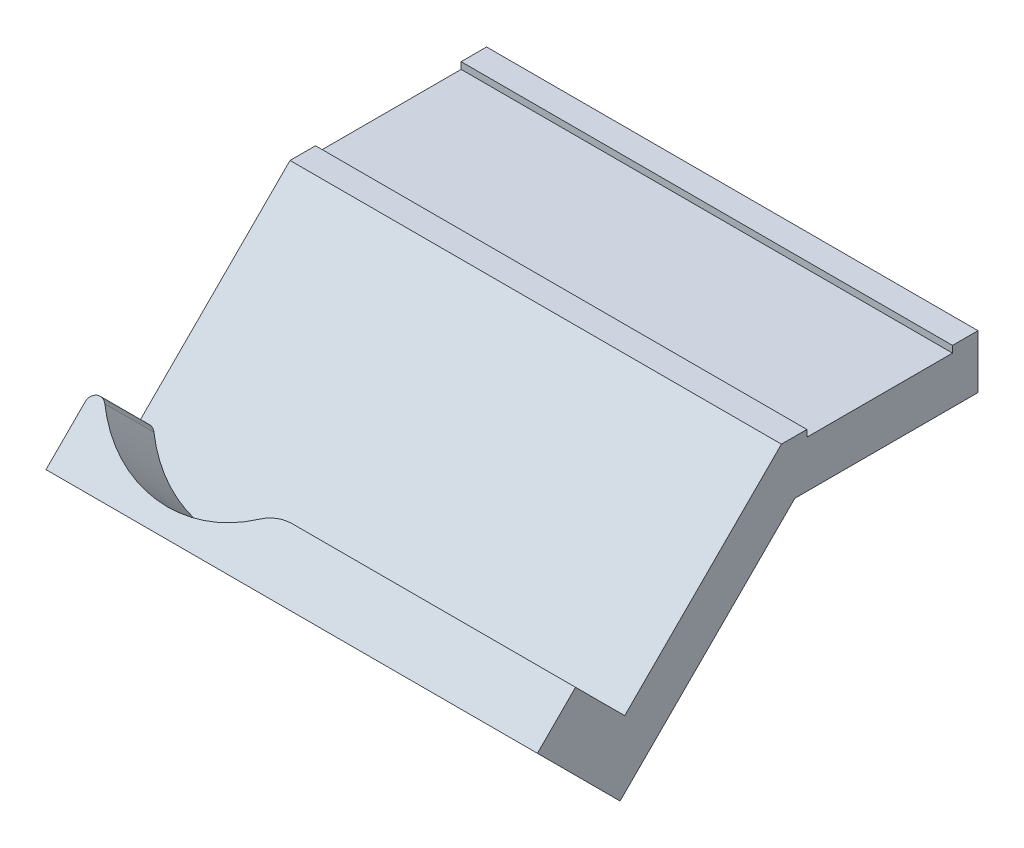
ISO-10303-21;
HEADER;
FILE_DESCRIPTION(('STEP AP214'),'2;1');
FILE_NAME('part.step','',(''),(''),'','','');
FILE_SCHEMA(('AUTOMOTIVE_DESIGN { 1 0 10303 214 1 1 1 1 }'));
ENDSEC;
DATA;
#1=APPLICATION_CONTEXT('core data for automotive mechanical design processes');
#2=APPLICATION_PROTOCOL_DEFINITION('international standard','automotive_design',2000,#1);
#3=PRODUCT_CONTEXT('',#1,'mechanical');
#4=PRODUCT('Part','Part','',(#3));
#5=PRODUCT_RELATED_PRODUCT_CATEGORY('part','',(#4));
#6=PRODUCT_DEFINITION_FORMATION('','',#4);
#7=PRODUCT_DEFINITION_CONTEXT('part definition',#1,'design');
#8=PRODUCT_DEFINITION('design','',#6,#7);
#9=PRODUCT_DEFINITION_SHAPE('','',#8);
#10=(LENGTH_UNIT() NAMED_UNIT(*) SI_UNIT(.MILLI.,.METRE.));
#11=(NAMED_UNIT(*) PLANE_ANGLE_UNIT() SI_UNIT($,.RADIAN.));
#12=(NAMED_UNIT(*) SI_UNIT($,.STERADIAN.) SOLID_ANGLE_UNIT());
#13=UNCERTAINTY_MEASURE_WITH_UNIT(LENGTH_MEASURE(1.E-05),#10,'distance_accuracy_value','');
#14=(GEOMETRIC_REPRESENTATION_CONTEXT(3) GLOBAL_UNCERTAINTY_ASSIGNED_CONTEXT((#13)) GLOBAL_UNIT_ASSIGNED_CONTEXT((#10,
#11,#12)) REPRESENTATION_CONTEXT('',''));
#15=CARTESIAN_POINT('',(0.,0.,0.));
#16=DIRECTION('',(0.,0.,1.));
#17=DIRECTION('',(1.,0.,0.));
#18=AXIS2_PLACEMENT_3D('',#15,#16,#17);
#19=CARTESIAN_POINT('',(55.,28.2499999999998,-48.25));
#20=DIRECTION('',(0.,-1.,0.));
#21=DIRECTION('',(0.,0.,-1.));
#22=AXIS2_PLACEMENT_3D('',#19,#20,#21);
#23=PLANE('',#22);
#24=DIRECTION('',(0.,0.,1.));
#25=VECTOR('',#24,1.);
#26=CARTESIAN_POINT('',(0.,28.2499999999998,-48.25));
#27=LINE('',#26,#25);
#28=CARTESIAN_POINT('',(0.,28.2499999999998,-48.25));
#29=VERTEX_POINT('',#28);
#30=CARTESIAN_POINT('',(0.,28.2499999999998,-45.4));
#31=VERTEX_POINT('',#30);
#32=EDGE_CURVE('E217',#29,#31,#27,.T.);
#33=ORIENTED_EDGE('',*,*,#32,.T.);
#34=DIRECTION('',(-1.,0.,0.));
#35=VECTOR('',#34,1.);
#36=CARTESIAN_POINT('',(0.,28.2499999999998,-45.4));
#37=LINE('',#36,#35);
#38=CARTESIAN_POINT('',(55.,28.2499999999998,-45.4));
#39=VERTEX_POINT('',#38);
#40=EDGE_CURVE('E181',#39,#31,#37,.T.);
#41=ORIENTED_EDGE('',*,*,#40,.F.);
#42=DIRECTION('',(0.,0.,1.));
#43=VECTOR('',#42,1.);
#44=CARTESIAN_POINT('',(55.,28.2499999999998,-48.25));
#45=LINE('',#44,#43);
#46=CARTESIAN_POINT('',(55.,28.2499999999998,-48.25));
#47=VERTEX_POINT('',#46);
#48=EDGE_CURVE('E213',#47,#39,#45,.T.);
#49=ORIENTED_EDGE('',*,*,#48,.F.);
#50=DIRECTION('',(1.,0.,0.));
#51=VECTOR('',#50,1.);
#52=CARTESIAN_POINT('',(55.,28.2499999999998,-48.25));
#53=LINE('',#52,#51);
#54=EDGE_CURVE('E210',#29,#47,#53,.T.);
#55=ORIENTED_EDGE('',*,*,#54,.F.);
#56=EDGE_LOOP('',(#33,#41,#49,#55));
#57=FACE_BOUND('',#56,.T.);
#58=ADVANCED_FACE('F35',(#57),#23,.F.);
#59=CARTESIAN_POINT('',(0.,50.,-30.75));
#60=DIRECTION('',(1.,0.,0.));
#61=DIRECTION('',(0.,0.,-1.));
#62=AXIS2_PLACEMENT_3D('',#59,#60,#61);
#63=PLANE('',#62);
#64=DIRECTION('',(0.,0.,1.));
#65=VECTOR('',#64,1.);
#66=CARTESIAN_POINT('',(0.,27.4999999999998,-45.4));
#67=LINE('',#66,#65);
#68=CARTESIAN_POINT('',(0.,27.4999999999998,-45.4));
#69=VERTEX_POINT('',#68);
#70=CARTESIAN_POINT('',(0.,27.4999999999998,-29.1));
#71=VERTEX_POINT('',#70);
#72=EDGE_CURVE('E177',#69,#71,#67,.T.);
#73=ORIENTED_EDGE('',*,*,#72,.F.);
#74=DIRECTION('',(0.,1.,0.));
#75=VECTOR('',#74,1.);
#76=CARTESIAN_POINT('',(0.,27.4999999999998,-45.4));
#77=LINE('',#76,#75);
#78=EDGE_CURVE('E191',#69,#31,#77,.T.);
#79=ORIENTED_EDGE('',*,*,#78,.T.);
#80=ORIENTED_EDGE('',*,*,#32,.F.);
#81=DIRECTION('',(0.,1.,0.));
#82=VECTOR('',#81,1.);
#83=CARTESIAN_POINT('',(0.,28.2499999999998,-48.25));
#84=LINE('',#83,#82);
#85=CARTESIAN_POINT('',(0.,22.2499999999998,-48.25));
#86=VERTEX_POINT('',#85);
#87=EDGE_CURVE('E208',#86,#29,#84,.T.);
#88=ORIENTED_EDGE('',*,*,#87,.F.);
#89=DIRECTION('',(0.,0.,1.));
#90=VECTOR('',#89,1.);
#91=CARTESIAN_POINT('',(0.,22.2499999999998,-48.25));
#92=LINE('',#91,#90);
#93=CARTESIAN_POINT('',(0.,22.2499999999998,-27.75));
#94=VERTEX_POINT('',#93);
#95=EDGE_CURVE('E220',#86,#94,#92,.T.);
#96=ORIENTED_EDGE('',*,*,#95,.T.);
#97=DIRECTION('',(0.,-0.707106781186547,0.707106781186547));
#98=VECTOR('',#97,1.);
#99=CARTESIAN_POINT('',(0.,20.7499999999998,-26.25));
#100=LINE('',#99,#98);
#101=CARTESIAN_POINT('',(0.,2.68933982822015,-8.18933982822031));
#102=VERTEX_POINT('',#101);
#103=EDGE_CURVE('E221',#94,#102,#100,.T.);
#104=ORIENTED_EDGE('',*,*,#103,.T.);
#105=DIRECTION('',(0.,0.707106781186547,0.707106781186548));
#106=VECTOR('',#105,1.);
#107=CARTESIAN_POINT('',(0.,11.9393398282203,1.06066017177984));
#108=LINE('',#107,#106);
#109=CARTESIAN_POINT('',(0.,11.9393398282203,1.06066017177984));
#110=VERTEX_POINT('',#109);
#111=EDGE_CURVE('E173',#102,#110,#108,.T.);
#112=ORIENTED_EDGE('',*,*,#111,.T.);
#113=DIRECTION('',(0.,0.707106781186548,-0.707106781186547));
#114=VECTOR('',#113,1.);
#115=CARTESIAN_POINT('',(0.,8.42893218813463,4.57106781186549));
#116=LINE('',#115,#114);
#117=CARTESIAN_POINT('',(0.,16.3045772723614,-3.30457727236128));
#118=VERTEX_POINT('',#117);
#119=EDGE_CURVE('E156',#110,#118,#116,.T.);
#120=ORIENTED_EDGE('',*,*,#119,.T.);
#121=DIRECTION('',(0.,0.707106781186551,0.707106781186544));
#122=VECTOR('',#121,1.);
#123=CARTESIAN_POINT('',(0.,10.8045772723613,-8.80457727236132));
#124=LINE('',#123,#122);
#125=CARTESIAN_POINT('',(0.,10.8045772723613,-8.80457727236132));
#126=VERTEX_POINT('',#125);
#127=EDGE_CURVE('E248',#118,#126,#124,.F.);
#128=ORIENTED_EDGE('',*,*,#127,.T.);
#129=DIRECTION('',(0.,-0.707106781186544,0.707106781186551));
#130=VECTOR('',#129,1.);
#131=CARTESIAN_POINT('',(0.,41.3749999999998,-39.3750000000001));
#132=LINE('',#131,#130);
#133=CARTESIAN_POINT('',(0.,28.2499999999998,-26.25));
#134=VERTEX_POINT('',#133);
#135=EDGE_CURVE('E231',#134,#126,#132,.T.);
#136=ORIENTED_EDGE('',*,*,#135,.F.);
#137=CARTESIAN_POINT('',(0.,28.2499999999998,-29.1));
#138=VERTEX_POINT('',#137);
#139=EDGE_CURVE('E216',#138,#134,#27,.T.);
#140=ORIENTED_EDGE('',*,*,#139,.F.);
#141=DIRECTION('',(0.,1.,0.));
#142=VECTOR('',#141,1.);
#143=CARTESIAN_POINT('',(0.,27.4999999999998,-29.1));
#144=LINE('',#143,#142);
#145=EDGE_CURVE('E52',#71,#138,#144,.T.);
#146=ORIENTED_EDGE('',*,*,#145,.F.);
#147=EDGE_LOOP('',(#73,#79,#80,#88,#96,#104,#112,#120,#128,#136,#140,#146));
#148=FACE_BOUND('',#147,.T.);
#149=ADVANCED_FACE('F273',(#148),#63,.F.);
#150=CARTESIAN_POINT('',(55.,50.,-30.75));
#151=DIRECTION('',(1.,0.,0.));
#152=DIRECTION('',(0.,0.,-1.));
#153=AXIS2_PLACEMENT_3D('',#150,#151,#152);
#154=PLANE('',#153);
#155=DIRECTION('',(0.,1.,0.));
#156=VECTOR('',#155,1.);
#157=CARTESIAN_POINT('',(55.,27.4999999999998,-45.4));
#158=LINE('',#157,#156);
#159=CARTESIAN_POINT('',(55.,27.4999999999998,-45.4));
#160=VERTEX_POINT('',#159);
#161=EDGE_CURVE('E195',#160,#39,#158,.T.);
#162=ORIENTED_EDGE('',*,*,#161,.F.);
#163=DIRECTION('',(0.,0.,-1.));
#164=VECTOR('',#163,1.);
#165=CARTESIAN_POINT('',(55.,27.4999999999998,-45.4));
#166=LINE('',#165,#164);
#167=CARTESIAN_POINT('',(55.,27.4999999999998,-29.1));
#168=VERTEX_POINT('',#167);
#169=EDGE_CURVE('E184',#168,#160,#166,.T.);
#170=ORIENTED_EDGE('',*,*,#169,.F.);
#171=DIRECTION('',(0.,1.,0.));
#172=VECTOR('',#171,1.);
#173=CARTESIAN_POINT('',(55.,27.4999999999998,-29.1));
#174=LINE('',#173,#172);
#175=CARTESIAN_POINT('',(55.,28.2499999999998,-29.1));
#176=VERTEX_POINT('',#175);
#177=EDGE_CURVE('E197',#168,#176,#174,.T.);
#178=ORIENTED_EDGE('',*,*,#177,.T.);
#179=CARTESIAN_POINT('',(55.,28.2499999999998,-26.25));
#180=VERTEX_POINT('',#179);
#181=EDGE_CURVE('E212',#176,#180,#45,.T.);
#182=ORIENTED_EDGE('',*,*,#181,.T.);
#183=DIRECTION('',(0.,0.707106781186544,-0.707106781186551));
#184=VECTOR('',#183,1.);
#185=CARTESIAN_POINT('',(55.,10.,-8.));
#186=LINE('',#185,#184);
#187=CARTESIAN_POINT('',(55.,10.7071067811866,-8.70710678118659));
#188=VERTEX_POINT('',#187);
#189=EDGE_CURVE('E239',#188,#180,#186,.T.);
#190=ORIENTED_EDGE('',*,*,#189,.F.);
#191=DIRECTION('',(0.,0.707106781186547,0.707106781186548));
#192=VECTOR('',#191,1.);
#193=CARTESIAN_POINT('',(55.,10.7071067811866,-8.70710678118659));
#194=LINE('',#193,#192);
#195=CARTESIAN_POINT('',(55.,16.2071067811866,-3.20710678118653));
#196=VERTEX_POINT('',#195);
#197=EDGE_CURVE('E153',#188,#196,#194,.T.);
#198=ORIENTED_EDGE('',*,*,#197,.T.);
#199=DIRECTION('',(0.,0.707106781186548,-0.707106781186547));
#200=VECTOR('',#199,1.);
#201=CARTESIAN_POINT('',(55.,8.42893218813463,4.57106781186549));
#202=LINE('',#201,#200);
#203=CARTESIAN_POINT('',(55.,11.9393398282203,1.06066017177983));
#204=VERTEX_POINT('',#203);
#205=EDGE_CURVE('E145',#204,#196,#202,.T.);
#206=ORIENTED_EDGE('',*,*,#205,.F.);
#207=DIRECTION('',(0.,-0.707106781186547,-0.707106781186548));
#208=VECTOR('',#207,1.);
#209=CARTESIAN_POINT('',(55.,11.9393398282203,1.06066017177983));
#210=LINE('',#209,#208);
#211=CARTESIAN_POINT('',(55.,2.68933982822015,-8.18933982822032));
#212=VERTEX_POINT('',#211);
#213=EDGE_CURVE('E150',#204,#212,#210,.T.);
#214=ORIENTED_EDGE('',*,*,#213,.T.);
#215=DIRECTION('',(0.,-0.707106781186547,0.707106781186547));
#216=VECTOR('',#215,1.);
#217=CARTESIAN_POINT('',(55.,20.7499999999998,-26.25));
#218=LINE('',#217,#216);
#219=CARTESIAN_POINT('',(55.,22.2499999999998,-27.75));
#220=VERTEX_POINT('',#219);
#221=EDGE_CURVE('E224',#220,#212,#218,.T.);
#222=ORIENTED_EDGE('',*,*,#221,.F.);
#223=DIRECTION('',(0.,0.,1.));
#224=VECTOR('',#223,1.);
#225=CARTESIAN_POINT('',(55.,22.2499999999998,-48.25));
#226=LINE('',#225,#224);
#227=CARTESIAN_POINT('',(55.,22.2499999999998,-48.25));
#228=VERTEX_POINT('',#227);
#229=EDGE_CURVE('E226',#228,#220,#226,.T.);
#230=ORIENTED_EDGE('',*,*,#229,.F.);
#231=DIRECTION('',(0.,-1.,0.));
#232=VECTOR('',#231,1.);
#233=CARTESIAN_POINT('',(55.,28.2499999999998,-48.25));
#234=LINE('',#233,#232);
#235=EDGE_CURVE('E203',#47,#228,#234,.T.);
#236=ORIENTED_EDGE('',*,*,#235,.F.);
#237=ORIENTED_EDGE('',*,*,#48,.T.);
#238=EDGE_LOOP('',(#162,#170,#178,#182,#190,#198,#206,#214,#222,#230,#236,#237));
#239=FACE_BOUND('',#238,.T.);
#240=ADVANCED_FACE('F148',(#239),#154,.T.);
#241=CARTESIAN_POINT('',(5.,10.,-8.));
#242=DIRECTION('',(0.,-0.707106781186551,-0.707106781186544));
#243=DIRECTION('',(0.,0.707106781186544,-0.707106781186551));
#244=AXIS2_PLACEMENT_3D('',#241,#242,#243);
#245=PLANE('',#244);
#246=ORIENTED_EDGE('',*,*,#189,.T.);
#247=DIRECTION('',(1.,0.,0.));
#248=VECTOR('',#247,1.);
#249=CARTESIAN_POINT('',(0.,28.2499999999998,-26.25));
#250=LINE('',#249,#248);
#251=EDGE_CURVE('E223',#134,#180,#250,.T.);
#252=ORIENTED_EDGE('',*,*,#251,.F.);
#253=ORIENTED_EDGE('',*,*,#135,.T.);
#254=CARTESIAN_POINT('',(1.,10.8045772723613,-8.80457727236132));
#255=DIRECTION('',(0.,-0.707106781186551,-0.707106781186544));
#256=DIRECTION('',(0.,0.707106781186544,-0.707106781186551));
#257=AXIS2_PLACEMENT_3D('',#254,#255,#256);
#258=CIRCLE('',#257,1.);
#259=CARTESIAN_POINT('',(1.74576271186441,11.2756600557405,-9.27566005574055));
#260=VERTEX_POINT('',#259);
#261=EDGE_CURVE('E251',#126,#260,#258,.T.);
#262=ORIENTED_EDGE('',*,*,#261,.T.);
#263=CARTESIAN_POINT('',(12.,17.7530483272049,-15.753048327205));
#264=DIRECTION('',(0.,0.707106781186551,0.707106781186544));
#265=DIRECTION('',(0.,-0.707106781186544,0.707106781186551));
#266=AXIS2_PLACEMENT_3D('',#263,#264,#265);
#267=CIRCLE('',#266,13.75);
#268=CARTESIAN_POINT('',(20.2846304274469,9.99329966244072,-7.99329966244071));
#269=VERTEX_POINT('',#268);
#270=EDGE_CURVE('E229',#260,#269,#267,.T.);
#271=ORIENTED_EDGE('',*,*,#270,.T.);
#272=CARTESIAN_POINT('',(23.2972233101549,7.17157287525373,-5.17157287525371));
#273=DIRECTION('',(0.,-0.707106781186551,-0.707106781186544));
#274=DIRECTION('',(0.,0.707106781186544,-0.707106781186551));
#275=AXIS2_PLACEMENT_3D('',#272,#273,#274);
#276=CIRCLE('',#275,5.);
#277=CARTESIAN_POINT('',(23.2972233101549,10.7071067811866,-8.70710678118659));
#278=VERTEX_POINT('',#277);
#279=EDGE_CURVE('E11',#269,#278,#276,.T.);
#280=ORIENTED_EDGE('',*,*,#279,.T.);
#281=DIRECTION('',(1.,0.,0.));
#282=VECTOR('',#281,1.);
#283=CARTESIAN_POINT('',(0.,10.7071067811866,-8.70710678118659));
#284=LINE('',#283,#282);
#285=EDGE_CURVE('E236',#278,#188,#284,.T.);
#286=ORIENTED_EDGE('',*,*,#285,.T.);
#287=EDGE_LOOP('',(#246,#252,#253,#262,#271,#280,#286));
#288=FACE_BOUND('',#287,.T.);
#289=ADVANCED_FACE('F295',(#288),#245,.F.);
#290=CARTESIAN_POINT('',(0.,10.7071067811866,-8.70710678118659));
#291=DIRECTION('',(0.,0.707106781186548,-0.707106781186547));
#292=DIRECTION('',(0.,0.707106781186547,0.707106781186548));
#293=AXIS2_PLACEMENT_3D('',#290,#291,#292);
#294=PLANE('',#293);
#295=ORIENTED_EDGE('',*,*,#285,.F.);
#296=DIRECTION('',(0.,-0.707106781186547,-0.707106781186548));
#297=VECTOR('',#296,1.);
#298=CARTESIAN_POINT('',(23.2972233101549,10.7071067811866,-8.70710678118659));
#299=LINE('',#298,#297);
#300=CARTESIAN_POINT('',(23.2972233101549,16.2071067811866,-3.20710678118653));
#301=VERTEX_POINT('',#300);
#302=EDGE_CURVE('E253',#278,#301,#299,.F.);
#303=ORIENTED_EDGE('',*,*,#302,.T.);
#304=DIRECTION('',(1.,0.,0.));
#305=VECTOR('',#304,1.);
#306=CARTESIAN_POINT('',(0.,16.2071067811866,-3.20710678118653));
#307=LINE('',#306,#305);
#308=EDGE_CURVE('E157',#301,#196,#307,.T.);
#309=ORIENTED_EDGE('',*,*,#308,.T.);
#310=ORIENTED_EDGE('',*,*,#197,.F.);
#311=EDGE_LOOP('',(#295,#303,#309,#310));
#312=FACE_BOUND('',#311,.T.);
#313=ADVANCED_FACE('F298',(#312),#294,.T.);
#314=CARTESIAN_POINT('',(0.,8.42893218813463,4.57106781186549));
#315=DIRECTION('',(0.,-0.707106781186547,-0.707106781186548));
#316=DIRECTION('',(0.,0.707106781186548,-0.707106781186547));
#317=AXIS2_PLACEMENT_3D('',#314,#315,#316);
#318=PLANE('',#317);
#319=ORIENTED_EDGE('',*,*,#308,.F.);
#320=CARTESIAN_POINT('',(23.2972233101549,12.6715728752538,0.32842712474631));
#321=DIRECTION('',(0.,-0.707106781186547,-0.707106781186548));
#322=DIRECTION('',(0.,0.707106781186548,-0.707106781186547));
#323=AXIS2_PLACEMENT_3D('',#320,#321,#322);
#324=CIRCLE('',#323,5.);
#325=CARTESIAN_POINT('',(20.2846304274469,15.4932996624408,-2.49329966244069));
#326=VERTEX_POINT('',#325);
#327=EDGE_CURVE('E256',#301,#326,#324,.F.);
#328=ORIENTED_EDGE('',*,*,#327,.T.);
#329=CARTESIAN_POINT('',(12.,23.2530483272051,-10.2530483272049));
#330=DIRECTION('',(0.,-0.707106781186547,-0.707106781186548));
#331=DIRECTION('',(0.,0.707106781186548,-0.707106781186547));
#332=AXIS2_PLACEMENT_3D('',#329,#330,#331);
#333=CIRCLE('',#332,13.75);
#334=CARTESIAN_POINT('',(1.74576271186441,16.7756600557406,-3.77566005574052));
#335=VERTEX_POINT('',#334);
#336=EDGE_CURVE('E233',#335,#326,#333,.F.);
#337=ORIENTED_EDGE('',*,*,#336,.F.);
#338=CARTESIAN_POINT('',(1.,16.3045772723614,-3.30457727236129));
#339=DIRECTION('',(0.,-0.707106781186547,-0.707106781186548));
#340=DIRECTION('',(0.,0.707106781186548,-0.707106781186547));
#341=AXIS2_PLACEMENT_3D('',#338,#339,#340);
#342=CIRCLE('',#341,1.);
#343=EDGE_CURVE('E246',#335,#118,#342,.F.);
#344=ORIENTED_EDGE('',*,*,#343,.T.);
#345=ORIENTED_EDGE('',*,*,#119,.F.);
#346=DIRECTION('',(1.,0.,0.));
#347=VECTOR('',#346,1.);
#348=CARTESIAN_POINT('',(-14.5814754519513,11.9393398282203,1.06066017177984));
#349=LINE('',#348,#347);
#350=EDGE_CURVE('E160',#110,#204,#349,.T.);
#351=ORIENTED_EDGE('',*,*,#350,.T.);
#352=ORIENTED_EDGE('',*,*,#205,.T.);
#353=EDGE_LOOP('',(#319,#328,#337,#344,#345,#351,#352));
#354=FACE_BOUND('',#353,.T.);
#355=ADVANCED_FACE('F161',(#354),#318,.F.);
#356=CARTESIAN_POINT('',(12.,41.7530483272051,8.24695167279495));
#357=DIRECTION('',(0.,-0.707106781186551,-0.707106781186544));
#358=DIRECTION('',(0.,0.707106781186544,-0.707106781186551));
#359=AXIS2_PLACEMENT_3D('',#356,#357,#358);
#360=CYLINDRICAL_SURFACE('',#359,13.75);
#361=ORIENTED_EDGE('',*,*,#336,.T.);
#362=DIRECTION('',(0.,-0.707106781186551,-0.707106781186544));
#363=VECTOR('',#362,1.);
#364=CARTESIAN_POINT('',(20.2846304274469,33.9932996624409,16.0067003375592));
#365=LINE('',#364,#363);
#366=EDGE_CURVE('E44',#326,#269,#365,.T.);
#367=ORIENTED_EDGE('',*,*,#366,.T.);
#368=ORIENTED_EDGE('',*,*,#270,.F.);
#369=DIRECTION('',(0.,-0.707106781186551,-0.707106781186544));
#370=VECTOR('',#369,1.);
#371=CARTESIAN_POINT('',(1.74576271186441,35.2756600557408,14.7243399442594));
#372=LINE('',#371,#370);
#373=EDGE_CURVE('E243',#260,#335,#372,.F.);
#374=ORIENTED_EDGE('',*,*,#373,.T.);
#375=EDGE_LOOP('',(#361,#367,#368,#374));
#376=FACE_BOUND('',#375,.T.);
#377=ADVANCED_FACE('F302',(#376),#360,.F.);
#378=CARTESIAN_POINT('',(1.,34.8045772723615,15.1954227276386));
#379=DIRECTION('',(0.,-0.707106781186551,-0.707106781186544));
#380=DIRECTION('',(0.,0.707106781186544,-0.707106781186551));
#381=AXIS2_PLACEMENT_3D('',#378,#379,#380);
#382=CYLINDRICAL_SURFACE('',#381,1.);
#383=ORIENTED_EDGE('',*,*,#261,.F.);
#384=ORIENTED_EDGE('',*,*,#127,.F.);
#385=ORIENTED_EDGE('',*,*,#343,.F.);
#386=ORIENTED_EDGE('',*,*,#373,.F.);
#387=EDGE_LOOP('',(#383,#384,#385,#386));
#388=FACE_BOUND('',#387,.T.);
#389=ADVANCED_FACE('F307',(#388),#382,.T.);
#390=CARTESIAN_POINT('',(23.2972233101549,31.1715728752539,18.8284271247462));
#391=DIRECTION('',(0.,-0.707106781186551,-0.707106781186544));
#392=DIRECTION('',(0.,0.707106781186544,-0.707106781186551));
#393=AXIS2_PLACEMENT_3D('',#390,#391,#392);
#394=CYLINDRICAL_SURFACE('',#393,5.);
#395=ORIENTED_EDGE('',*,*,#279,.F.);
#396=ORIENTED_EDGE('',*,*,#366,.F.);
#397=ORIENTED_EDGE('',*,*,#327,.F.);
#398=ORIENTED_EDGE('',*,*,#302,.F.);
#399=EDGE_LOOP('',(#395,#396,#397,#398));
#400=FACE_BOUND('',#399,.T.);
#401=ADVANCED_FACE('F37',(#400),#394,.T.);
#402=CARTESIAN_POINT('',(0.,20.7499999999998,-26.25));
#403=DIRECTION('',(0.,0.707106781186548,0.707106781186547));
#404=DIRECTION('',(0.,-0.707106781186547,0.707106781186548));
#405=AXIS2_PLACEMENT_3D('',#402,#403,#404);
#406=PLANE('',#405);
#407=ORIENTED_EDGE('',*,*,#221,.T.);
#408=DIRECTION('',(1.,0.,0.));
#409=VECTOR('',#408,1.);
#410=CARTESIAN_POINT('',(-14.5814754519513,2.68933982822015,-8.1893398282203));
#411=LINE('',#410,#409);
#412=EDGE_CURVE('E166',#102,#212,#411,.T.);
#413=ORIENTED_EDGE('',*,*,#412,.F.);
#414=ORIENTED_EDGE('',*,*,#103,.F.);
#415=DIRECTION('',(-1.,0.,0.));
#416=VECTOR('',#415,1.);
#417=CARTESIAN_POINT('',(55.,22.2499999999998,-27.75));
#418=LINE('',#417,#416);
#419=EDGE_CURVE('E194',#220,#94,#418,.T.);
#420=ORIENTED_EDGE('',*,*,#419,.F.);
#421=EDGE_LOOP('',(#407,#413,#414,#420));
#422=FACE_BOUND('',#421,.T.);
#423=ADVANCED_FACE('F270',(#422),#406,.F.);
#424=CARTESIAN_POINT('',(55.,22.2499999999998,-48.25));
#425=DIRECTION('',(0.,1.,0.));
#426=DIRECTION('',(0.,0.,1.));
#427=AXIS2_PLACEMENT_3D('',#424,#425,#426);
#428=PLANE('',#427);
#429=ORIENTED_EDGE('',*,*,#229,.T.);
#430=ORIENTED_EDGE('',*,*,#419,.T.);
#431=ORIENTED_EDGE('',*,*,#95,.F.);
#432=DIRECTION('',(-1.,0.,0.));
#433=VECTOR('',#432,1.);
#434=CARTESIAN_POINT('',(55.,22.2499999999998,-48.25));
#435=LINE('',#434,#433);
#436=EDGE_CURVE('E206',#228,#86,#435,.T.);
#437=ORIENTED_EDGE('',*,*,#436,.F.);
#438=EDGE_LOOP('',(#429,#430,#431,#437));
#439=FACE_BOUND('',#438,.T.);
#440=ADVANCED_FACE('F265',(#439),#428,.F.);
#441=ORIENTED_EDGE('',*,*,#181,.F.);
#442=DIRECTION('',(1.,0.,0.));
#443=VECTOR('',#442,1.);
#444=CARTESIAN_POINT('',(0.,28.2499999999998,-29.1));
#445=LINE('',#444,#443);
#446=EDGE_CURVE('E176',#138,#176,#445,.T.);
#447=ORIENTED_EDGE('',*,*,#446,.F.);
#448=ORIENTED_EDGE('',*,*,#139,.T.);
#449=ORIENTED_EDGE('',*,*,#251,.T.);
#450=EDGE_LOOP('',(#441,#447,#448,#449));
#451=FACE_BOUND('',#450,.T.);
#452=ADVANCED_FACE('F293',(#451),#23,.F.);
#453=CARTESIAN_POINT('',(0.,0.,-48.25));
#454=DIRECTION('',(0.,0.,-1.));
#455=DIRECTION('',(-1.,0.,0.));
#456=AXIS2_PLACEMENT_3D('',#453,#454,#455);
#457=PLANE('',#456);
#458=ORIENTED_EDGE('',*,*,#235,.T.);
#459=ORIENTED_EDGE('',*,*,#436,.T.);
#460=ORIENTED_EDGE('',*,*,#87,.T.);
#461=ORIENTED_EDGE('',*,*,#54,.T.);
#462=EDGE_LOOP('',(#458,#459,#460,#461));
#463=FACE_BOUND('',#462,.T.);
#464=ADVANCED_FACE('F278',(#463),#457,.T.);
#465=CARTESIAN_POINT('',(0.,27.4999999999998,-45.4));
#466=DIRECTION('',(0.,0.,-1.));
#467=DIRECTION('',(-1.,0.,0.));
#468=AXIS2_PLACEMENT_3D('',#465,#466,#467);
#469=PLANE('',#468);
#470=ORIENTED_EDGE('',*,*,#40,.T.);
#471=ORIENTED_EDGE('',*,*,#78,.F.);
#472=DIRECTION('',(-1.,0.,0.));
#473=VECTOR('',#472,1.);
#474=CARTESIAN_POINT('',(0.,27.4999999999998,-45.4));
#475=LINE('',#474,#473);
#476=EDGE_CURVE('E186',#160,#69,#475,.T.);
#477=ORIENTED_EDGE('',*,*,#476,.F.);
#478=ORIENTED_EDGE('',*,*,#161,.T.);
#479=EDGE_LOOP('',(#470,#471,#477,#478));
#480=FACE_BOUND('',#479,.T.);
#481=ADVANCED_FACE('F285',(#480),#469,.F.);
#482=CARTESIAN_POINT('',(0.,27.4999999999998,-29.1));
#483=DIRECTION('',(0.,0.,1.));
#484=DIRECTION('',(1.,0.,0.));
#485=AXIS2_PLACEMENT_3D('',#482,#483,#484);
#486=PLANE('',#485);
#487=ORIENTED_EDGE('',*,*,#446,.T.);
#488=ORIENTED_EDGE('',*,*,#177,.F.);
#489=DIRECTION('',(1.,0.,0.));
#490=VECTOR('',#489,1.);
#491=CARTESIAN_POINT('',(0.,27.4999999999998,-29.1));
#492=LINE('',#491,#490);
#493=EDGE_CURVE('E180',#71,#168,#492,.T.);
#494=ORIENTED_EDGE('',*,*,#493,.F.);
#495=ORIENTED_EDGE('',*,*,#145,.T.);
#496=EDGE_LOOP('',(#487,#488,#494,#495));
#497=FACE_BOUND('',#496,.T.);
#498=ADVANCED_FACE('F386',(#497),#486,.F.);
#499=CARTESIAN_POINT('',(0.,27.4999999999998,0.));
#500=DIRECTION('',(0.,1.,0.));
#501=DIRECTION('',(0.,0.,1.));
#502=AXIS2_PLACEMENT_3D('',#499,#500,#501);
#503=PLANE('',#502);
#504=ORIENTED_EDGE('',*,*,#72,.T.);
#505=ORIENTED_EDGE('',*,*,#493,.T.);
#506=ORIENTED_EDGE('',*,*,#169,.T.);
#507=ORIENTED_EDGE('',*,*,#476,.T.);
#508=EDGE_LOOP('',(#504,#505,#506,#507));
#509=FACE_BOUND('',#508,.T.);
#510=ADVANCED_FACE('F287',(#509),#503,.T.);
#511=CARTESIAN_POINT('',(-14.5814754519513,11.9393398282203,1.06066017177984));
#512=DIRECTION('',(0.,-0.707106781186548,0.707106781186547));
#513=DIRECTION('',(0.,-0.707106781186547,-0.707106781186548));
#514=AXIS2_PLACEMENT_3D('',#511,#512,#513);
#515=PLANE('',#514);
#516=ORIENTED_EDGE('',*,*,#111,.F.);
#517=ORIENTED_EDGE('',*,*,#412,.T.);
#518=ORIENTED_EDGE('',*,*,#213,.F.);
#519=ORIENTED_EDGE('',*,*,#350,.F.);
#520=EDGE_LOOP('',(#516,#517,#518,#519));
#521=FACE_BOUND('',#520,.T.);
#522=ADVANCED_FACE('F169',(#521),#515,.T.);
#523=CLOSED_SHELL('',(#58,#149,#240,#289,#313,#355,#377,#389,#401,#423,#440,#452,#464,#481,#498,
#510,#522));
#524=MANIFOLD_SOLID_BREP('B2',#523);
#525=ADVANCED_BREP_SHAPE_REPRESENTATION('',(#18,#524),#14);
#526=SHAPE_DEFINITION_REPRESENTATION(#9,#525);
ENDSEC;
END-ISO-10303-21;
